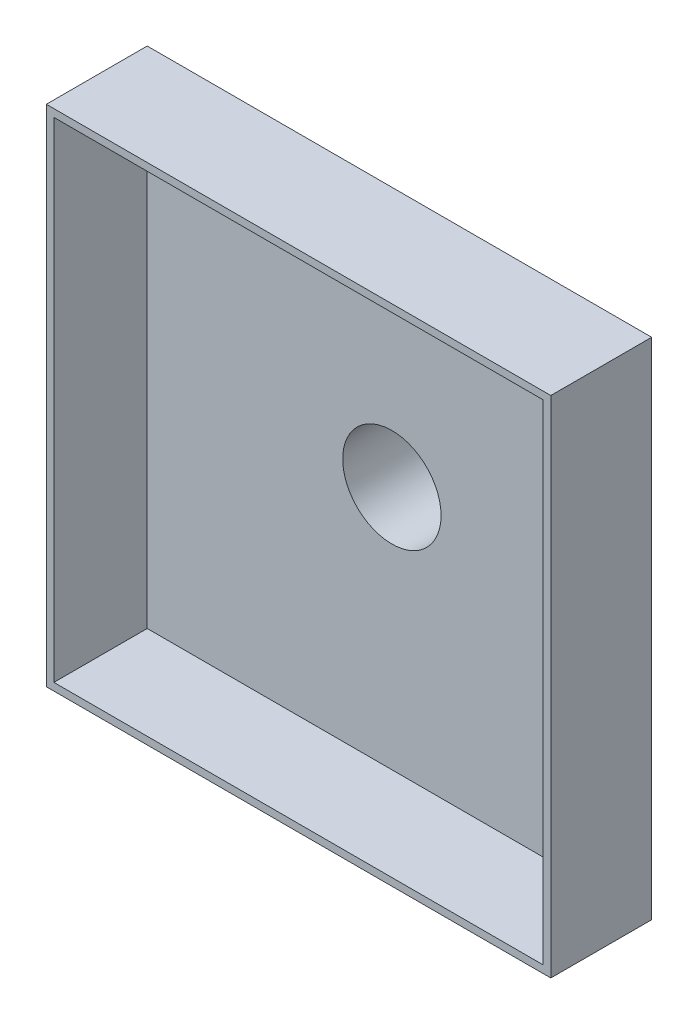
ISO-10303-21;
HEADER;
FILE_DESCRIPTION(('STEP AP214'),'2;1');
FILE_NAME('part.step','',(''),(''),'','','');
FILE_SCHEMA(('AUTOMOTIVE_DESIGN { 1 0 10303 214 1 1 1 1 }'));
ENDSEC;
DATA;
#1=APPLICATION_CONTEXT('core data for automotive mechanical design processes');
#2=APPLICATION_PROTOCOL_DEFINITION('international standard','automotive_design',2000,#1);
#3=PRODUCT_CONTEXT('',#1,'mechanical');
#4=PRODUCT('Part','Part','',(#3));
#5=PRODUCT_RELATED_PRODUCT_CATEGORY('part','',(#4));
#6=PRODUCT_DEFINITION_FORMATION('','',#4);
#7=PRODUCT_DEFINITION_CONTEXT('part definition',#1,'design');
#8=PRODUCT_DEFINITION('design','',#6,#7);
#9=PRODUCT_DEFINITION_SHAPE('','',#8);
#10=(LENGTH_UNIT() NAMED_UNIT(*) SI_UNIT(.MILLI.,.METRE.));
#11=(NAMED_UNIT(*) PLANE_ANGLE_UNIT() SI_UNIT($,.RADIAN.));
#12=(NAMED_UNIT(*) SI_UNIT($,.STERADIAN.) SOLID_ANGLE_UNIT());
#13=UNCERTAINTY_MEASURE_WITH_UNIT(LENGTH_MEASURE(1.E-05),#10,'distance_accuracy_value','');
#14=(GEOMETRIC_REPRESENTATION_CONTEXT(3) GLOBAL_UNCERTAINTY_ASSIGNED_CONTEXT((#13)) GLOBAL_UNIT_ASSIGNED_CONTEXT((#10,
#11,#12)) REPRESENTATION_CONTEXT('',''));
#15=CARTESIAN_POINT('',(0.,0.,0.));
#16=DIRECTION('',(0.,0.,1.));
#17=DIRECTION('',(1.,0.,0.));
#18=AXIS2_PLACEMENT_3D('',#15,#16,#17);
#19=CARTESIAN_POINT('',(100.,100.,40.));
#20=DIRECTION('',(-1.,0.,0.));
#21=DIRECTION('',(0.,-1.,0.));
#22=AXIS2_PLACEMENT_3D('',#19,#20,#21);
#23=PLANE('',#22);
#24=DIRECTION('',(0.,1.,0.));
#25=VECTOR('',#24,1.);
#26=CARTESIAN_POINT('',(100.,100.,0.));
#27=LINE('',#26,#25);
#28=CARTESIAN_POINT('',(100.,-100.,0.));
#29=VERTEX_POINT('',#28);
#30=CARTESIAN_POINT('',(100.,100.,0.));
#31=VERTEX_POINT('',#30);
#32=EDGE_CURVE('E153',#29,#31,#27,.T.);
#33=ORIENTED_EDGE('',*,*,#32,.T.);
#34=DIRECTION('',(0.,0.,-1.));
#35=VECTOR('',#34,1.);
#36=CARTESIAN_POINT('',(100.,100.,40.));
#37=LINE('',#36,#35);
#38=CARTESIAN_POINT('',(100.,100.,40.));
#39=VERTEX_POINT('',#38);
#40=EDGE_CURVE('E11',#39,#31,#37,.T.);
#41=ORIENTED_EDGE('',*,*,#40,.F.);
#42=DIRECTION('',(0.,1.,0.));
#43=VECTOR('',#42,1.);
#44=CARTESIAN_POINT('',(100.,100.,40.));
#45=LINE('',#44,#43);
#46=CARTESIAN_POINT('',(100.,-100.,40.));
#47=VERTEX_POINT('',#46);
#48=EDGE_CURVE('E157',#47,#39,#45,.T.);
#49=ORIENTED_EDGE('',*,*,#48,.F.);
#50=DIRECTION('',(0.,0.,-1.));
#51=VECTOR('',#50,1.);
#52=CARTESIAN_POINT('',(100.,-100.,40.));
#53=LINE('',#52,#51);
#54=EDGE_CURVE('E163',#47,#29,#53,.T.);
#55=ORIENTED_EDGE('',*,*,#54,.T.);
#56=EDGE_LOOP('',(#33,#41,#49,#55));
#57=FACE_BOUND('',#56,.T.);
#58=ADVANCED_FACE('F37',(#57),#23,.F.);
#59=CARTESIAN_POINT('',(-100.,100.,40.));
#60=DIRECTION('',(0.,-1.,0.));
#61=DIRECTION('',(0.,0.,-1.));
#62=AXIS2_PLACEMENT_3D('',#59,#60,#61);
#63=PLANE('',#62);
#64=DIRECTION('',(-1.,0.,0.));
#65=VECTOR('',#64,1.);
#66=CARTESIAN_POINT('',(-100.,100.,0.));
#67=LINE('',#66,#65);
#68=CARTESIAN_POINT('',(-100.,100.,0.));
#69=VERTEX_POINT('',#68);
#70=EDGE_CURVE('E166',#31,#69,#67,.T.);
#71=ORIENTED_EDGE('',*,*,#70,.T.);
#72=DIRECTION('',(0.,0.,-1.));
#73=VECTOR('',#72,1.);
#74=CARTESIAN_POINT('',(-100.,100.,40.));
#75=LINE('',#74,#73);
#76=CARTESIAN_POINT('',(-100.,100.,40.));
#77=VERTEX_POINT('',#76);
#78=EDGE_CURVE('E44',#77,#69,#75,.T.);
#79=ORIENTED_EDGE('',*,*,#78,.F.);
#80=DIRECTION('',(-1.,0.,0.));
#81=VECTOR('',#80,1.);
#82=CARTESIAN_POINT('',(-100.,100.,40.));
#83=LINE('',#82,#81);
#84=EDGE_CURVE('E88',#39,#77,#83,.T.);
#85=ORIENTED_EDGE('',*,*,#84,.F.);
#86=ORIENTED_EDGE('',*,*,#40,.T.);
#87=EDGE_LOOP('',(#71,#79,#85,#86));
#88=FACE_BOUND('',#87,.T.);
#89=ADVANCED_FACE('F195',(#88),#63,.F.);
#90=CARTESIAN_POINT('',(-100.,100.,40.));
#91=DIRECTION('',(1.,0.,0.));
#92=DIRECTION('',(0.,1.,0.));
#93=AXIS2_PLACEMENT_3D('',#90,#91,#92);
#94=PLANE('',#93);
#95=DIRECTION('',(0.,-1.,0.));
#96=VECTOR('',#95,1.);
#97=CARTESIAN_POINT('',(-100.,100.,0.));
#98=LINE('',#97,#96);
#99=CARTESIAN_POINT('',(-99.9999999999999,-100.,0.));
#100=VERTEX_POINT('',#99);
#101=EDGE_CURVE('E168',#69,#100,#98,.T.);
#102=ORIENTED_EDGE('',*,*,#101,.T.);
#103=DIRECTION('',(0.,0.,-1.));
#104=VECTOR('',#103,1.);
#105=CARTESIAN_POINT('',(-99.9999999999999,-100.,40.));
#106=LINE('',#105,#104);
#107=CARTESIAN_POINT('',(-99.9999999999999,-100.,40.));
#108=VERTEX_POINT('',#107);
#109=EDGE_CURVE('E172',#108,#100,#106,.T.);
#110=ORIENTED_EDGE('',*,*,#109,.F.);
#111=DIRECTION('',(0.,-1.,0.));
#112=VECTOR('',#111,1.);
#113=CARTESIAN_POINT('',(-100.,100.,40.));
#114=LINE('',#113,#112);
#115=EDGE_CURVE('E160',#77,#108,#114,.T.);
#116=ORIENTED_EDGE('',*,*,#115,.F.);
#117=ORIENTED_EDGE('',*,*,#78,.T.);
#118=EDGE_LOOP('',(#102,#110,#116,#117));
#119=FACE_BOUND('',#118,.T.);
#120=ADVANCED_FACE('F177',(#119),#94,.F.);
#121=CARTESIAN_POINT('',(-99.9999999999999,-100.,40.));
#122=DIRECTION('',(0.,1.,0.));
#123=DIRECTION('',(0.,0.,1.));
#124=AXIS2_PLACEMENT_3D('',#121,#122,#123);
#125=PLANE('',#124);
#126=DIRECTION('',(1.,0.,0.));
#127=VECTOR('',#126,1.);
#128=CARTESIAN_POINT('',(-99.9999999999999,-100.,0.));
#129=LINE('',#128,#127);
#130=EDGE_CURVE('E81',#100,#29,#129,.T.);
#131=ORIENTED_EDGE('',*,*,#130,.T.);
#132=ORIENTED_EDGE('',*,*,#54,.F.);
#133=DIRECTION('',(1.,0.,0.));
#134=VECTOR('',#133,1.);
#135=CARTESIAN_POINT('',(-99.9999999999999,-100.,40.));
#136=LINE('',#135,#134);
#137=EDGE_CURVE('E60',#108,#47,#136,.T.);
#138=ORIENTED_EDGE('',*,*,#137,.F.);
#139=ORIENTED_EDGE('',*,*,#109,.T.);
#140=EDGE_LOOP('',(#131,#132,#138,#139));
#141=FACE_BOUND('',#140,.T.);
#142=ADVANCED_FACE('F185',(#141),#125,.F.);
#143=CARTESIAN_POINT('',(0.,0.,40.));
#144=DIRECTION('',(0.,0.,1.));
#145=DIRECTION('',(1.,0.,0.));
#146=AXIS2_PLACEMENT_3D('',#143,#144,#145);
#147=PLANE('',#146);
#148=DIRECTION('',(0.,1.,0.));
#149=VECTOR('',#148,1.);
#150=CARTESIAN_POINT('',(97.,100.,40.));
#151=LINE('',#150,#149);
#152=CARTESIAN_POINT('',(97.,-97.,40.));
#153=VERTEX_POINT('',#152);
#154=CARTESIAN_POINT('',(97.,97.,40.));
#155=VERTEX_POINT('',#154);
#156=EDGE_CURVE('E133',#153,#155,#151,.T.);
#157=ORIENTED_EDGE('',*,*,#156,.F.);
#158=DIRECTION('',(1.,0.,0.));
#159=VECTOR('',#158,1.);
#160=CARTESIAN_POINT('',(-99.9999999999999,-97.,40.));
#161=LINE('',#160,#159);
#162=CARTESIAN_POINT('',(-96.9999999999999,-97.,40.));
#163=VERTEX_POINT('',#162);
#164=EDGE_CURVE('E148',#163,#153,#161,.T.);
#165=ORIENTED_EDGE('',*,*,#164,.F.);
#166=DIRECTION('',(0.,-1.,0.));
#167=VECTOR('',#166,1.);
#168=CARTESIAN_POINT('',(-97.,100.,40.));
#169=LINE('',#168,#167);
#170=CARTESIAN_POINT('',(-97.,97.,40.));
#171=VERTEX_POINT('',#170);
#172=EDGE_CURVE('E146',#171,#163,#169,.T.);
#173=ORIENTED_EDGE('',*,*,#172,.F.);
#174=DIRECTION('',(-1.,0.,0.));
#175=VECTOR('',#174,1.);
#176=CARTESIAN_POINT('',(-100.,97.,40.));
#177=LINE('',#176,#175);
#178=EDGE_CURVE('E125',#155,#171,#177,.T.);
#179=ORIENTED_EDGE('',*,*,#178,.F.);
#180=EDGE_LOOP('',(#157,#165,#173,#179));
#181=FACE_BOUND('',#180,.T.);
#182=ORIENTED_EDGE('',*,*,#48,.T.);
#183=ORIENTED_EDGE('',*,*,#84,.T.);
#184=ORIENTED_EDGE('',*,*,#115,.T.);
#185=ORIENTED_EDGE('',*,*,#137,.T.);
#186=EDGE_LOOP('',(#182,#183,#184,#185));
#187=FACE_BOUND('',#186,.T.);
#188=ADVANCED_FACE('F187',(#181,#187),#147,.T.);
#189=CARTESIAN_POINT('',(0.,0.,0.));
#190=DIRECTION('',(0.,0.,1.));
#191=DIRECTION('',(1.,0.,0.));
#192=AXIS2_PLACEMENT_3D('',#189,#190,#191);
#193=PLANE('',#192);
#194=CARTESIAN_POINT('',(0.,0.,0.));
#195=DIRECTION('',(0.,0.,1.));
#196=DIRECTION('',(1.,0.,0.));
#197=AXIS2_PLACEMENT_3D('',#194,#195,#196);
#198=CIRCLE('',#197,22.5);
#199=CARTESIAN_POINT('',(22.5,0.,0.));
#200=VERTEX_POINT('',#199);
#201=EDGE_CURVE('E154',#200,#200,#198,.T.);
#202=ORIENTED_EDGE('',*,*,#201,.T.);
#203=EDGE_LOOP('',(#202));
#204=FACE_BOUND('',#203,.T.);
#205=ORIENTED_EDGE('',*,*,#32,.F.);
#206=ORIENTED_EDGE('',*,*,#130,.F.);
#207=ORIENTED_EDGE('',*,*,#101,.F.);
#208=ORIENTED_EDGE('',*,*,#70,.F.);
#209=EDGE_LOOP('',(#205,#206,#207,#208));
#210=FACE_BOUND('',#209,.T.);
#211=ADVANCED_FACE('F181',(#204,#210),#193,.F.);
#212=CARTESIAN_POINT('',(0.,0.,-40.));
#213=DIRECTION('',(0.,0.,1.));
#214=DIRECTION('',(1.,0.,0.));
#215=AXIS2_PLACEMENT_3D('',#212,#213,#214);
#216=CYLINDRICAL_SURFACE('',#215,22.5);
#217=CARTESIAN_POINT('',(0.,0.,-40.));
#218=DIRECTION('',(0.,0.,1.));
#219=DIRECTION('',(1.,0.,0.));
#220=AXIS2_PLACEMENT_3D('',#217,#218,#219);
#221=CIRCLE('',#220,22.5);
#222=CARTESIAN_POINT('',(22.5,0.,-40.));
#223=VERTEX_POINT('',#222);
#224=EDGE_CURVE('E150',#223,#223,#221,.T.);
#225=ORIENTED_EDGE('',*,*,#224,.T.);
#226=EDGE_LOOP('',(#225));
#227=FACE_BOUND('',#226,.T.);
#228=ORIENTED_EDGE('',*,*,#201,.F.);
#229=EDGE_LOOP('',(#228));
#230=FACE_BOUND('',#229,.T.);
#231=ADVANCED_FACE('F224',(#227,#230),#216,.T.);
#232=CARTESIAN_POINT('',(0.,0.,-40.));
#233=DIRECTION('',(0.,0.,1.));
#234=DIRECTION('',(1.,0.,0.));
#235=AXIS2_PLACEMENT_3D('',#232,#233,#234);
#236=PLANE('',#235);
#237=ORIENTED_EDGE('',*,*,#224,.F.);
#238=EDGE_LOOP('',(#237));
#239=FACE_BOUND('',#238,.T.);
#240=ADVANCED_FACE('F234',(#239),#236,.F.);
#241=CARTESIAN_POINT('',(97.,100.,40.));
#242=DIRECTION('',(-1.,0.,0.));
#243=DIRECTION('',(0.,-1.,0.));
#244=AXIS2_PLACEMENT_3D('',#241,#242,#243);
#245=PLANE('',#244);
#246=DIRECTION('',(0.,1.,0.));
#247=VECTOR('',#246,1.);
#248=CARTESIAN_POINT('',(97.,100.,3.));
#249=LINE('',#248,#247);
#250=CARTESIAN_POINT('',(97.,-97.,3.));
#251=VERTEX_POINT('',#250);
#252=CARTESIAN_POINT('',(97.,97.,3.));
#253=VERTEX_POINT('',#252);
#254=EDGE_CURVE('E116',#251,#253,#249,.T.);
#255=ORIENTED_EDGE('',*,*,#254,.F.);
#256=DIRECTION('',(0.,0.,-1.));
#257=VECTOR('',#256,1.);
#258=CARTESIAN_POINT('',(97.,-97.,40.));
#259=LINE('',#258,#257);
#260=EDGE_CURVE('E136',#153,#251,#259,.T.);
#261=ORIENTED_EDGE('',*,*,#260,.F.);
#262=ORIENTED_EDGE('',*,*,#156,.T.);
#263=DIRECTION('',(0.,0.,-1.));
#264=VECTOR('',#263,1.);
#265=CARTESIAN_POINT('',(97.,97.,40.));
#266=LINE('',#265,#264);
#267=EDGE_CURVE('E128',#155,#253,#266,.T.);
#268=ORIENTED_EDGE('',*,*,#267,.T.);
#269=EDGE_LOOP('',(#255,#261,#262,#268));
#270=FACE_BOUND('',#269,.T.);
#271=ADVANCED_FACE('F245',(#270),#245,.T.);
#272=CARTESIAN_POINT('',(-100.,97.,40.));
#273=DIRECTION('',(0.,-1.,0.));
#274=DIRECTION('',(0.,0.,-1.));
#275=AXIS2_PLACEMENT_3D('',#272,#273,#274);
#276=PLANE('',#275);
#277=DIRECTION('',(-1.,0.,0.));
#278=VECTOR('',#277,1.);
#279=CARTESIAN_POINT('',(-100.,97.,3.));
#280=LINE('',#279,#278);
#281=CARTESIAN_POINT('',(-97.,97.,3.));
#282=VERTEX_POINT('',#281);
#283=EDGE_CURVE('E110',#253,#282,#280,.T.);
#284=ORIENTED_EDGE('',*,*,#283,.F.);
#285=ORIENTED_EDGE('',*,*,#267,.F.);
#286=ORIENTED_EDGE('',*,*,#178,.T.);
#287=DIRECTION('',(0.,0.,-1.));
#288=VECTOR('',#287,1.);
#289=CARTESIAN_POINT('',(-97.,97.,40.));
#290=LINE('',#289,#288);
#291=EDGE_CURVE('E122',#171,#282,#290,.T.);
#292=ORIENTED_EDGE('',*,*,#291,.T.);
#293=EDGE_LOOP('',(#284,#285,#286,#292));
#294=FACE_BOUND('',#293,.T.);
#295=ADVANCED_FACE('F123',(#294),#276,.T.);
#296=CARTESIAN_POINT('',(-97.,100.,40.));
#297=DIRECTION('',(1.,0.,0.));
#298=DIRECTION('',(0.,1.,0.));
#299=AXIS2_PLACEMENT_3D('',#296,#297,#298);
#300=PLANE('',#299);
#301=DIRECTION('',(0.,-1.,0.));
#302=VECTOR('',#301,1.);
#303=CARTESIAN_POINT('',(-97.,100.,3.));
#304=LINE('',#303,#302);
#305=CARTESIAN_POINT('',(-96.9999999999999,-97.,3.));
#306=VERTEX_POINT('',#305);
#307=EDGE_CURVE('E114',#282,#306,#304,.T.);
#308=ORIENTED_EDGE('',*,*,#307,.F.);
#309=ORIENTED_EDGE('',*,*,#291,.F.);
#310=ORIENTED_EDGE('',*,*,#172,.T.);
#311=DIRECTION('',(0.,0.,-1.));
#312=VECTOR('',#311,1.);
#313=CARTESIAN_POINT('',(-96.9999999999999,-97.,40.));
#314=LINE('',#313,#312);
#315=EDGE_CURVE('E51',#163,#306,#314,.T.);
#316=ORIENTED_EDGE('',*,*,#315,.T.);
#317=EDGE_LOOP('',(#308,#309,#310,#316));
#318=FACE_BOUND('',#317,.T.);
#319=ADVANCED_FACE('F130',(#318),#300,.T.);
#320=CARTESIAN_POINT('',(-99.9999999999999,-97.,40.));
#321=DIRECTION('',(0.,1.,0.));
#322=DIRECTION('',(0.,0.,1.));
#323=AXIS2_PLACEMENT_3D('',#320,#321,#322);
#324=PLANE('',#323);
#325=DIRECTION('',(1.,0.,0.));
#326=VECTOR('',#325,1.);
#327=CARTESIAN_POINT('',(-99.9999999999999,-97.,3.));
#328=LINE('',#327,#326);
#329=EDGE_CURVE('E131',#306,#251,#328,.T.);
#330=ORIENTED_EDGE('',*,*,#329,.F.);
#331=ORIENTED_EDGE('',*,*,#315,.F.);
#332=ORIENTED_EDGE('',*,*,#164,.T.);
#333=ORIENTED_EDGE('',*,*,#260,.T.);
#334=EDGE_LOOP('',(#330,#331,#332,#333));
#335=FACE_BOUND('',#334,.T.);
#336=ADVANCED_FACE('F281',(#335),#324,.T.);
#337=CARTESIAN_POINT('',(0.,0.,3.));
#338=DIRECTION('',(0.,0.,1.));
#339=DIRECTION('',(1.,0.,0.));
#340=AXIS2_PLACEMENT_3D('',#337,#338,#339);
#341=PLANE('',#340);
#342=CARTESIAN_POINT('',(0.,0.,3.));
#343=DIRECTION('',(0.,0.,1.));
#344=DIRECTION('',(1.,0.,0.));
#345=AXIS2_PLACEMENT_3D('',#342,#343,#344);
#346=CIRCLE('',#345,19.5);
#347=CARTESIAN_POINT('',(19.5,0.,3.));
#348=VERTEX_POINT('',#347);
#349=EDGE_CURVE('E138',#348,#348,#346,.T.);
#350=ORIENTED_EDGE('',*,*,#349,.F.);
#351=EDGE_LOOP('',(#350));
#352=FACE_BOUND('',#351,.T.);
#353=ORIENTED_EDGE('',*,*,#254,.T.);
#354=ORIENTED_EDGE('',*,*,#283,.T.);
#355=ORIENTED_EDGE('',*,*,#307,.T.);
#356=ORIENTED_EDGE('',*,*,#329,.T.);
#357=EDGE_LOOP('',(#353,#354,#355,#356));
#358=FACE_BOUND('',#357,.T.);
#359=ADVANCED_FACE('F112',(#352,#358),#341,.T.);
#360=CARTESIAN_POINT('',(0.,0.,-40.));
#361=DIRECTION('',(0.,0.,1.));
#362=DIRECTION('',(1.,0.,0.));
#363=AXIS2_PLACEMENT_3D('',#360,#361,#362);
#364=CYLINDRICAL_SURFACE('',#363,19.5);
#365=CARTESIAN_POINT('',(0.,0.,-37.));
#366=DIRECTION('',(0.,0.,1.));
#367=DIRECTION('',(1.,0.,0.));
#368=AXIS2_PLACEMENT_3D('',#365,#366,#367);
#369=CIRCLE('',#368,19.5);
#370=CARTESIAN_POINT('',(19.5,0.,-37.));
#371=VERTEX_POINT('',#370);
#372=EDGE_CURVE('E141',#371,#371,#369,.T.);
#373=ORIENTED_EDGE('',*,*,#372,.F.);
#374=EDGE_LOOP('',(#373));
#375=FACE_BOUND('',#374,.T.);
#376=ORIENTED_EDGE('',*,*,#349,.T.);
#377=EDGE_LOOP('',(#376));
#378=FACE_BOUND('',#377,.T.);
#379=ADVANCED_FACE('F300',(#375,#378),#364,.F.);
#380=CARTESIAN_POINT('',(0.,0.,-37.));
#381=DIRECTION('',(0.,0.,1.));
#382=DIRECTION('',(1.,0.,0.));
#383=AXIS2_PLACEMENT_3D('',#380,#381,#382);
#384=PLANE('',#383);
#385=ORIENTED_EDGE('',*,*,#372,.T.);
#386=EDGE_LOOP('',(#385));
#387=FACE_BOUND('',#386,.T.);
#388=ADVANCED_FACE('F311',(#387),#384,.T.);
#389=CLOSED_SHELL('',(#58,#89,#120,#142,#188,#211,#231,#240,#271,#295,#319,#336,#359,#379,#388));
#390=MANIFOLD_SOLID_BREP('B2',#389);
#391=ADVANCED_BREP_SHAPE_REPRESENTATION('',(#18,#390),#14);
#392=SHAPE_DEFINITION_REPRESENTATION(#9,#391);
ENDSEC;
END-ISO-10303-21;
